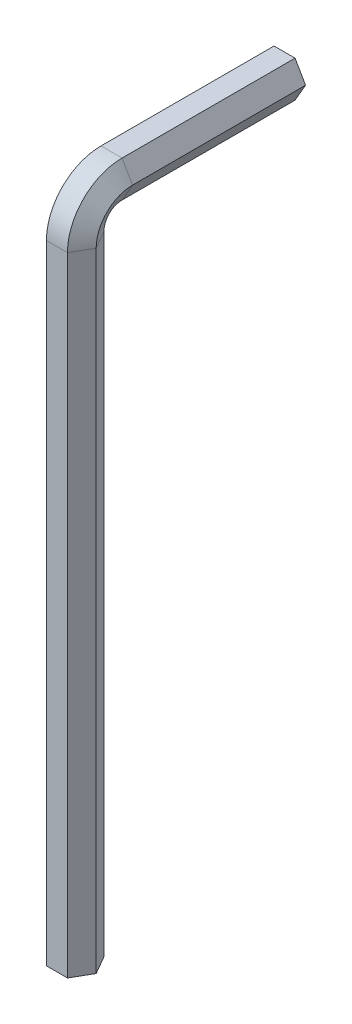
ISO-10303-21;
HEADER;
FILE_DESCRIPTION(('STEP AP214'),'2;1');
FILE_NAME('part.step','',(''),(''),'','','');
FILE_SCHEMA(('AUTOMOTIVE_DESIGN { 1 0 10303 214 1 1 1 1 }'));
ENDSEC;
DATA;
#1=APPLICATION_CONTEXT('core data for automotive mechanical design processes');
#2=APPLICATION_PROTOCOL_DEFINITION('international standard','automotive_design',2000,#1);
#3=PRODUCT_CONTEXT('',#1,'mechanical');
#4=PRODUCT('Part','Part','',(#3));
#5=PRODUCT_RELATED_PRODUCT_CATEGORY('part','',(#4));
#6=PRODUCT_DEFINITION_FORMATION('','',#4);
#7=PRODUCT_DEFINITION_CONTEXT('part definition',#1,'design');
#8=PRODUCT_DEFINITION('design','',#6,#7);
#9=PRODUCT_DEFINITION_SHAPE('','',#8);
#10=(LENGTH_UNIT() NAMED_UNIT(*) SI_UNIT(.MILLI.,.METRE.));
#11=(NAMED_UNIT(*) PLANE_ANGLE_UNIT() SI_UNIT($,.RADIAN.));
#12=(NAMED_UNIT(*) SI_UNIT($,.STERADIAN.) SOLID_ANGLE_UNIT());
#13=UNCERTAINTY_MEASURE_WITH_UNIT(LENGTH_MEASURE(1.E-05),#10,'distance_accuracy_value','');
#14=(GEOMETRIC_REPRESENTATION_CONTEXT(3) GLOBAL_UNCERTAINTY_ASSIGNED_CONTEXT((#13)) GLOBAL_UNIT_ASSIGNED_CONTEXT((#10,
#11,#12)) REPRESENTATION_CONTEXT('',''));
#15=CARTESIAN_POINT('',(0.,0.,0.));
#16=DIRECTION('',(0.,0.,1.));
#17=DIRECTION('',(1.,0.,0.));
#18=AXIS2_PLACEMENT_3D('',#15,#16,#17);
#19=CARTESIAN_POINT('',(0.,0.,-75.));
#20=DIRECTION('',(0.,-1.,0.));
#21=DIRECTION('',(1.,0.,0.));
#22=AXIS2_PLACEMENT_3D('',#19,#20,#21);
#23=PLANE('',#22);
#24=DIRECTION('',(-1.,0.,0.));
#25=VECTOR('',#24,1.);
#26=CARTESIAN_POINT('',(1.15470053837931,0.,0.));
#27=LINE('',#26,#25);
#28=CARTESIAN_POINT('',(1.15470053837931,0.,0.));
#29=VERTEX_POINT('',#28);
#30=CARTESIAN_POINT('',(-1.15470053837919,0.,0.));
#31=VERTEX_POINT('',#30);
#32=EDGE_CURVE('E206',#29,#31,#27,.T.);
#33=ORIENTED_EDGE('',*,*,#32,.T.);
#34=DIRECTION('',(-0.500000000000001,0.,-0.866025403784438));
#35=VECTOR('',#34,1.);
#36=CARTESIAN_POINT('',(-1.15470053837919,0.,0.));
#37=LINE('',#36,#35);
#38=CARTESIAN_POINT('',(-2.30940107675844,0.,-1.99999999999999));
#39=VERTEX_POINT('',#38);
#40=EDGE_CURVE('E159',#31,#39,#37,.T.);
#41=ORIENTED_EDGE('',*,*,#40,.T.);
#42=DIRECTION('',(0.5,0.,-0.866025403784438));
#43=VECTOR('',#42,1.);
#44=CARTESIAN_POINT('',(-2.30940107675844,0.,-1.99999999999999));
#45=LINE('',#44,#43);
#46=CARTESIAN_POINT('',(-1.15470053837918,0.,-3.99999999999999));
#47=VERTEX_POINT('',#46);
#48=EDGE_CURVE('E155',#39,#47,#45,.T.);
#49=ORIENTED_EDGE('',*,*,#48,.T.);
#50=DIRECTION('',(1.,0.,0.));
#51=VECTOR('',#50,1.);
#52=CARTESIAN_POINT('',(-1.15470053837918,0.,-3.99999999999999));
#53=LINE('',#52,#51);
#54=CARTESIAN_POINT('',(1.15470053837931,0.,-3.99999999999999));
#55=VERTEX_POINT('',#54);
#56=EDGE_CURVE('E144',#47,#55,#53,.T.);
#57=ORIENTED_EDGE('',*,*,#56,.T.);
#58=DIRECTION('',(0.500000000000002,0.,0.866025403784437));
#59=VECTOR('',#58,1.);
#60=CARTESIAN_POINT('',(1.15470053837931,0.,-3.99999999999999));
#61=LINE('',#60,#59);
#62=CARTESIAN_POINT('',(2.30940107675856,0.,-2.));
#63=VERTEX_POINT('',#62);
#64=EDGE_CURVE('E241',#55,#63,#61,.T.);
#65=ORIENTED_EDGE('',*,*,#64,.T.);
#66=DIRECTION('',(-0.499999999999998,0.,0.866025403784439));
#67=VECTOR('',#66,1.);
#68=CARTESIAN_POINT('',(2.30940107675856,0.,-2.));
#69=LINE('',#68,#67);
#70=EDGE_CURVE('E264',#63,#29,#69,.T.);
#71=ORIENTED_EDGE('',*,*,#70,.T.);
#72=EDGE_LOOP('',(#33,#41,#49,#57,#65,#71));
#73=FACE_BOUND('',#72,.T.);
#74=ADVANCED_FACE('F44',(#73),#23,.T.);
#75=CARTESIAN_POINT('',(0.,0.,-25.));
#76=DIRECTION('',(0.,0.,1.));
#77=DIRECTION('',(1.,0.,0.));
#78=AXIS2_PLACEMENT_3D('',#75,#76,#77);
#79=PLANE('',#78);
#80=DIRECTION('',(-1.,0.,0.));
#81=VECTOR('',#80,1.);
#82=CARTESIAN_POINT('',(1.15470053837931,75.,-25.));
#83=LINE('',#82,#81);
#84=CARTESIAN_POINT('',(1.15470053837931,75.,-25.));
#85=VERTEX_POINT('',#84);
#86=CARTESIAN_POINT('',(-1.15470053837919,75.,-25.));
#87=VERTEX_POINT('',#86);
#88=EDGE_CURVE('E171',#85,#87,#83,.T.);
#89=ORIENTED_EDGE('',*,*,#88,.F.);
#90=DIRECTION('',(-0.499999999999998,0.866025403784439,0.));
#91=VECTOR('',#90,1.);
#92=CARTESIAN_POINT('',(2.30940107675856,73.,-25.));
#93=LINE('',#92,#91);
#94=CARTESIAN_POINT('',(2.30940107675856,73.,-25.));
#95=VERTEX_POINT('',#94);
#96=EDGE_CURVE('E11',#95,#85,#93,.T.);
#97=ORIENTED_EDGE('',*,*,#96,.F.);
#98=DIRECTION('',(0.500000000000002,0.866025403784437,0.));
#99=VECTOR('',#98,1.);
#100=CARTESIAN_POINT('',(1.15470053837931,71.,-25.));
#101=LINE('',#100,#99);
#102=CARTESIAN_POINT('',(1.15470053837931,71.,-25.));
#103=VERTEX_POINT('',#102);
#104=EDGE_CURVE('E58',#103,#95,#101,.T.);
#105=ORIENTED_EDGE('',*,*,#104,.F.);
#106=DIRECTION('',(1.,0.,0.));
#107=VECTOR('',#106,1.);
#108=CARTESIAN_POINT('',(-1.15470053837918,71.,-25.));
#109=LINE('',#108,#107);
#110=CARTESIAN_POINT('',(-1.15470053837918,71.,-25.));
#111=VERTEX_POINT('',#110);
#112=EDGE_CURVE('E67',#111,#103,#109,.T.);
#113=ORIENTED_EDGE('',*,*,#112,.F.);
#114=DIRECTION('',(0.5,-0.866025403784438,0.));
#115=VECTOR('',#114,1.);
#116=CARTESIAN_POINT('',(-2.30940107675844,73.,-25.));
#117=LINE('',#116,#115);
#118=CARTESIAN_POINT('',(-2.30940107675844,73.,-25.));
#119=VERTEX_POINT('',#118);
#120=EDGE_CURVE('E189',#119,#111,#117,.T.);
#121=ORIENTED_EDGE('',*,*,#120,.F.);
#122=DIRECTION('',(-0.500000000000001,-0.866025403784438,0.));
#123=VECTOR('',#122,1.);
#124=CARTESIAN_POINT('',(-1.15470053837919,75.,-25.));
#125=LINE('',#124,#123);
#126=EDGE_CURVE('E187',#87,#119,#125,.T.);
#127=ORIENTED_EDGE('',*,*,#126,.F.);
#128=EDGE_LOOP('',(#89,#97,#105,#113,#121,#127));
#129=FACE_BOUND('',#128,.T.);
#130=ADVANCED_FACE('F190',(#129),#79,.F.);
#131=CARTESIAN_POINT('',(1.15470053837931,0.,0.));
#132=DIRECTION('',(0.,0.,-1.));
#133=DIRECTION('',(0.,1.,0.));
#134=AXIS2_PLACEMENT_3D('',#131,#132,#133);
#135=PLANE('',#134);
#136=DIRECTION('',(0.,1.,0.));
#137=VECTOR('',#136,1.);
#138=CARTESIAN_POINT('',(-1.15470053837919,0.,0.));
#139=LINE('',#138,#137);
#140=CARTESIAN_POINT('',(-1.15470053837919,69.,0.));
#141=VERTEX_POINT('',#140);
#142=EDGE_CURVE('E215',#31,#141,#139,.T.);
#143=ORIENTED_EDGE('',*,*,#142,.F.);
#144=ORIENTED_EDGE('',*,*,#32,.F.);
#145=DIRECTION('',(0.,1.,0.));
#146=VECTOR('',#145,1.);
#147=CARTESIAN_POINT('',(1.15470053837931,0.,0.));
#148=LINE('',#147,#146);
#149=CARTESIAN_POINT('',(1.15470053837931,69.,0.));
#150=VERTEX_POINT('',#149);
#151=EDGE_CURVE('E288',#29,#150,#148,.T.);
#152=ORIENTED_EDGE('',*,*,#151,.T.);
#153=DIRECTION('',(-1.,0.,0.));
#154=VECTOR('',#153,1.);
#155=CARTESIAN_POINT('',(1.15470053837931,69.,0.));
#156=LINE('',#155,#154);
#157=EDGE_CURVE('E307',#150,#141,#156,.T.);
#158=ORIENTED_EDGE('',*,*,#157,.T.);
#159=EDGE_LOOP('',(#143,#144,#152,#158));
#160=FACE_BOUND('',#159,.T.);
#161=ADVANCED_FACE('F322',(#160),#135,.F.);
#162=CARTESIAN_POINT('',(-1.15470053837919,0.,0.));
#163=DIRECTION('',(0.866025403784438,0.,-0.500000000000001));
#164=DIRECTION('',(-0.500000000000001,0.,-0.866025403784438));
#165=AXIS2_PLACEMENT_3D('',#162,#163,#164);
#166=PLANE('',#165);
#167=DIRECTION('',(0.,1.,0.));
#168=VECTOR('',#167,1.);
#169=CARTESIAN_POINT('',(-2.30940107675844,0.,-1.99999999999999));
#170=LINE('',#169,#168);
#171=CARTESIAN_POINT('',(-2.30940107675844,69.,-1.99999999999997));
#172=VERTEX_POINT('',#171);
#173=EDGE_CURVE('E211',#39,#172,#170,.T.);
#174=ORIENTED_EDGE('',*,*,#173,.F.);
#175=ORIENTED_EDGE('',*,*,#40,.F.);
#176=ORIENTED_EDGE('',*,*,#142,.T.);
#177=DIRECTION('',(-0.500000000000001,0.,-0.866025403784438));
#178=VECTOR('',#177,1.);
#179=CARTESIAN_POINT('',(-1.15470053837919,69.,0.));
#180=LINE('',#179,#178);
#181=EDGE_CURVE('E210',#141,#172,#180,.T.);
#182=ORIENTED_EDGE('',*,*,#181,.T.);
#183=EDGE_LOOP('',(#174,#175,#176,#182));
#184=FACE_BOUND('',#183,.T.);
#185=ADVANCED_FACE('F324',(#184),#166,.F.);
#186=CARTESIAN_POINT('',(-2.30940107675844,0.,-1.99999999999999));
#187=DIRECTION('',(0.866025403784438,0.,0.5));
#188=DIRECTION('',(0.5,0.,-0.866025403784438));
#189=AXIS2_PLACEMENT_3D('',#186,#187,#188);
#190=PLANE('',#189);
#191=DIRECTION('',(0.,1.,0.));
#192=VECTOR('',#191,1.);
#193=CARTESIAN_POINT('',(-1.15470053837918,0.,-3.99999999999999));
#194=LINE('',#193,#192);
#195=CARTESIAN_POINT('',(-1.15470053837918,69.,-3.99999999999997));
#196=VERTEX_POINT('',#195);
#197=EDGE_CURVE('E226',#47,#196,#194,.T.);
#198=ORIENTED_EDGE('',*,*,#197,.F.);
#199=ORIENTED_EDGE('',*,*,#48,.F.);
#200=ORIENTED_EDGE('',*,*,#173,.T.);
#201=DIRECTION('',(0.5,0.,-0.866025403784438));
#202=VECTOR('',#201,1.);
#203=CARTESIAN_POINT('',(-2.30940107675844,69.,-1.99999999999997));
#204=LINE('',#203,#202);
#205=EDGE_CURVE('E214',#172,#196,#204,.T.);
#206=ORIENTED_EDGE('',*,*,#205,.T.);
#207=EDGE_LOOP('',(#198,#199,#200,#206));
#208=FACE_BOUND('',#207,.T.);
#209=ADVANCED_FACE('F377',(#208),#190,.F.);
#210=CARTESIAN_POINT('',(-1.15470053837918,0.,-3.99999999999999));
#211=DIRECTION('',(0.,0.,1.));
#212=DIRECTION('',(0.,-1.,0.));
#213=AXIS2_PLACEMENT_3D('',#210,#211,#212);
#214=PLANE('',#213);
#215=DIRECTION('',(0.,1.,0.));
#216=VECTOR('',#215,1.);
#217=CARTESIAN_POINT('',(1.15470053837931,0.,-3.99999999999999));
#218=LINE('',#217,#216);
#219=CARTESIAN_POINT('',(1.15470053837931,69.,-3.99999999999997));
#220=VERTEX_POINT('',#219);
#221=EDGE_CURVE('E248',#55,#220,#218,.T.);
#222=ORIENTED_EDGE('',*,*,#221,.F.);
#223=ORIENTED_EDGE('',*,*,#56,.F.);
#224=ORIENTED_EDGE('',*,*,#197,.T.);
#225=DIRECTION('',(1.,0.,0.));
#226=VECTOR('',#225,1.);
#227=CARTESIAN_POINT('',(-1.15470053837918,69.,-3.99999999999998));
#228=LINE('',#227,#226);
#229=EDGE_CURVE('E235',#196,#220,#228,.T.);
#230=ORIENTED_EDGE('',*,*,#229,.T.);
#231=EDGE_LOOP('',(#222,#223,#224,#230));
#232=FACE_BOUND('',#231,.T.);
#233=ADVANCED_FACE('F390',(#232),#214,.F.);
#234=CARTESIAN_POINT('',(1.15470053837931,0.,-3.99999999999999));
#235=DIRECTION('',(-0.866025403784437,0.,0.500000000000002));
#236=DIRECTION('',(0.500000000000002,0.,0.866025403784437));
#237=AXIS2_PLACEMENT_3D('',#234,#235,#236);
#238=PLANE('',#237);
#239=DIRECTION('',(0.,1.,0.));
#240=VECTOR('',#239,1.);
#241=CARTESIAN_POINT('',(2.30940107675856,0.,-2.));
#242=LINE('',#241,#240);
#243=CARTESIAN_POINT('',(2.30940107675856,69.,-1.99999999999999));
#244=VERTEX_POINT('',#243);
#245=EDGE_CURVE('E267',#63,#244,#242,.T.);
#246=ORIENTED_EDGE('',*,*,#245,.F.);
#247=ORIENTED_EDGE('',*,*,#64,.F.);
#248=ORIENTED_EDGE('',*,*,#221,.T.);
#249=DIRECTION('',(0.500000000000002,0.,0.866025403784437));
#250=VECTOR('',#249,1.);
#251=CARTESIAN_POINT('',(1.15470053837931,69.,-3.99999999999998));
#252=LINE('',#251,#250);
#253=EDGE_CURVE('E252',#220,#244,#252,.T.);
#254=ORIENTED_EDGE('',*,*,#253,.T.);
#255=EDGE_LOOP('',(#246,#247,#248,#254));
#256=FACE_BOUND('',#255,.T.);
#257=ADVANCED_FACE('F396',(#256),#238,.F.);
#258=CARTESIAN_POINT('',(2.30940107675856,0.,-2.));
#259=DIRECTION('',(-0.86602540378444,0.,-0.499999999999998));
#260=DIRECTION('',(-0.499999999999998,0.,0.86602540378444));
#261=AXIS2_PLACEMENT_3D('',#258,#259,#260);
#262=PLANE('',#261);
#263=DIRECTION('',(-0.499999999999998,0.,0.866025403784439));
#264=VECTOR('',#263,1.);
#265=CARTESIAN_POINT('',(2.30940107675856,69.,-1.99999999999999));
#266=LINE('',#265,#264);
#267=EDGE_CURVE('E272',#244,#150,#266,.T.);
#268=ORIENTED_EDGE('',*,*,#267,.T.);
#269=ORIENTED_EDGE('',*,*,#151,.F.);
#270=ORIENTED_EDGE('',*,*,#70,.F.);
#271=ORIENTED_EDGE('',*,*,#245,.T.);
#272=EDGE_LOOP('',(#268,#269,#270,#271));
#273=FACE_BOUND('',#272,.T.);
#274=ADVANCED_FACE('F337',(#273),#262,.F.);
#275=CARTESIAN_POINT('',(0.,69.,-5.99999999999998));
#276=DIRECTION('',(-1.,0.,0.));
#277=DIRECTION('',(0.,0.,1.));
#278=AXIS2_PLACEMENT_3D('',#275,#276,#277);
#279=CYLINDRICAL_SURFACE('',#278,6.);
#280=CARTESIAN_POINT('',(-1.15470053837919,69.,-5.99999999999998));
#281=DIRECTION('',(-1.,0.,0.));
#282=DIRECTION('',(0.,0.,1.));
#283=AXIS2_PLACEMENT_3D('',#280,#281,#282);
#284=CIRCLE('',#283,6.);
#285=CARTESIAN_POINT('',(-1.15470053837919,75.,-5.99999999999997));
#286=VERTEX_POINT('',#285);
#287=EDGE_CURVE('E217',#141,#286,#284,.T.);
#288=ORIENTED_EDGE('',*,*,#287,.F.);
#289=ORIENTED_EDGE('',*,*,#157,.F.);
#290=CARTESIAN_POINT('',(1.15470053837931,69.,-5.99999999999998));
#291=DIRECTION('',(-1.,0.,0.));
#292=DIRECTION('',(0.,0.,1.));
#293=AXIS2_PLACEMENT_3D('',#290,#291,#292);
#294=CIRCLE('',#293,6.);
#295=CARTESIAN_POINT('',(1.15470053837931,75.,-5.99999999999997));
#296=VERTEX_POINT('',#295);
#297=EDGE_CURVE('E292',#150,#296,#294,.T.);
#298=ORIENTED_EDGE('',*,*,#297,.T.);
#299=DIRECTION('',(-1.,0.,0.));
#300=VECTOR('',#299,1.);
#301=CARTESIAN_POINT('',(1.15470053837931,75.,-5.99999999999997));
#302=LINE('',#301,#300);
#303=EDGE_CURVE('E298',#296,#286,#302,.T.);
#304=ORIENTED_EDGE('',*,*,#303,.T.);
#305=EDGE_LOOP('',(#288,#289,#298,#304));
#306=FACE_BOUND('',#305,.T.);
#307=ADVANCED_FACE('F304',(#306),#279,.T.);
#308=CARTESIAN_POINT('',(-1.15470053837919,69.,-5.99999999999998));
#309=DIRECTION('',(1.,0.,0.));
#310=DIRECTION('',(0.,0.,-1.));
#311=AXIS2_PLACEMENT_3D('',#308,#309,#310);
#312=CONICAL_SURFACE('',#311,6.,1.0471975511966);
#313=CARTESIAN_POINT('',(-2.30940107675844,69.,-5.99999999999998));
#314=DIRECTION('',(-1.,0.,0.));
#315=DIRECTION('',(0.,0.,1.));
#316=AXIS2_PLACEMENT_3D('',#313,#314,#315);
#317=CIRCLE('',#316,4.00000000000001);
#318=CARTESIAN_POINT('',(-2.30940107675844,73.,-5.99999999999997));
#319=VERTEX_POINT('',#318);
#320=EDGE_CURVE('E135',#172,#319,#317,.T.);
#321=ORIENTED_EDGE('',*,*,#320,.F.);
#322=ORIENTED_EDGE('',*,*,#181,.F.);
#323=ORIENTED_EDGE('',*,*,#287,.T.);
#324=DIRECTION('',(-0.500000000000001,-0.866025403784438,0.));
#325=VECTOR('',#324,1.);
#326=CARTESIAN_POINT('',(-1.15470053837919,75.,-5.99999999999997));
#327=LINE('',#326,#325);
#328=EDGE_CURVE('E194',#286,#319,#327,.T.);
#329=ORIENTED_EDGE('',*,*,#328,.T.);
#330=EDGE_LOOP('',(#321,#322,#323,#329));
#331=FACE_BOUND('',#330,.T.);
#332=ADVANCED_FACE('F326',(#331),#312,.T.);
#333=CARTESIAN_POINT('',(-2.30940107675844,69.,-5.99999999999998));
#334=DIRECTION('',(-1.,0.,0.));
#335=DIRECTION('',(0.,0.,1.));
#336=AXIS2_PLACEMENT_3D('',#333,#334,#335);
#337=CONICAL_SURFACE('',#336,4.00000000000001,1.0471975511966);
#338=CARTESIAN_POINT('',(-1.15470053837918,69.,-5.99999999999998));
#339=DIRECTION('',(-1.,0.,0.));
#340=DIRECTION('',(0.,0.,1.));
#341=AXIS2_PLACEMENT_3D('',#338,#339,#340);
#342=CIRCLE('',#341,2.00000000000001);
#343=CARTESIAN_POINT('',(-1.15470053837918,71.,-5.99999999999997));
#344=VERTEX_POINT('',#343);
#345=EDGE_CURVE('E122',#196,#344,#342,.T.);
#346=ORIENTED_EDGE('',*,*,#345,.F.);
#347=ORIENTED_EDGE('',*,*,#205,.F.);
#348=ORIENTED_EDGE('',*,*,#320,.T.);
#349=DIRECTION('',(0.5,-0.866025403784438,0.));
#350=VECTOR('',#349,1.);
#351=CARTESIAN_POINT('',(-2.30940107675844,73.,-5.99999999999997));
#352=LINE('',#351,#350);
#353=EDGE_CURVE('E219',#319,#344,#352,.T.);
#354=ORIENTED_EDGE('',*,*,#353,.T.);
#355=EDGE_LOOP('',(#346,#347,#348,#354));
#356=FACE_BOUND('',#355,.T.);
#357=ADVANCED_FACE('F327',(#356),#337,.F.);
#358=CARTESIAN_POINT('',(0.,69.,-5.99999999999998));
#359=DIRECTION('',(-1.,0.,0.));
#360=DIRECTION('',(0.,0.,1.));
#361=AXIS2_PLACEMENT_3D('',#358,#359,#360);
#362=CYLINDRICAL_SURFACE('',#361,2.00000000000001);
#363=CARTESIAN_POINT('',(1.15470053837931,69.,-5.99999999999998));
#364=DIRECTION('',(-1.,0.,0.));
#365=DIRECTION('',(0.,0.,1.));
#366=AXIS2_PLACEMENT_3D('',#363,#364,#365);
#367=CIRCLE('',#366,2.00000000000001);
#368=CARTESIAN_POINT('',(1.15470053837931,71.,-5.99999999999997));
#369=VERTEX_POINT('',#368);
#370=EDGE_CURVE('E117',#220,#369,#367,.T.);
#371=ORIENTED_EDGE('',*,*,#370,.F.);
#372=ORIENTED_EDGE('',*,*,#229,.F.);
#373=ORIENTED_EDGE('',*,*,#345,.T.);
#374=DIRECTION('',(1.,0.,0.));
#375=VECTOR('',#374,1.);
#376=CARTESIAN_POINT('',(-1.15470053837918,71.,-5.99999999999997));
#377=LINE('',#376,#375);
#378=EDGE_CURVE('E240',#344,#369,#377,.T.);
#379=ORIENTED_EDGE('',*,*,#378,.T.);
#380=EDGE_LOOP('',(#371,#372,#373,#379));
#381=FACE_BOUND('',#380,.T.);
#382=ADVANCED_FACE('F331',(#381),#362,.F.);
#383=CARTESIAN_POINT('',(1.15470053837931,69.,-5.99999999999998));
#384=DIRECTION('',(1.,0.,0.));
#385=DIRECTION('',(0.,0.,-1.));
#386=AXIS2_PLACEMENT_3D('',#383,#384,#385);
#387=CONICAL_SURFACE('',#386,2.00000000000001,1.0471975511966);
#388=CARTESIAN_POINT('',(2.30940107675856,69.,-5.99999999999998));
#389=DIRECTION('',(-1.,0.,0.));
#390=DIRECTION('',(0.,0.,1.));
#391=AXIS2_PLACEMENT_3D('',#388,#389,#390);
#392=CIRCLE('',#391,4.);
#393=CARTESIAN_POINT('',(2.30940107675856,73.,-5.99999999999997));
#394=VERTEX_POINT('',#393);
#395=EDGE_CURVE('E280',#244,#394,#392,.T.);
#396=ORIENTED_EDGE('',*,*,#395,.F.);
#397=ORIENTED_EDGE('',*,*,#253,.F.);
#398=ORIENTED_EDGE('',*,*,#370,.T.);
#399=DIRECTION('',(0.500000000000002,0.866025403784437,0.));
#400=VECTOR('',#399,1.);
#401=CARTESIAN_POINT('',(1.15470053837931,71.,-5.99999999999997));
#402=LINE('',#401,#400);
#403=EDGE_CURVE('E260',#369,#394,#402,.T.);
#404=ORIENTED_EDGE('',*,*,#403,.T.);
#405=EDGE_LOOP('',(#396,#397,#398,#404));
#406=FACE_BOUND('',#405,.T.);
#407=ADVANCED_FACE('F437',(#406),#387,.F.);
#408=CARTESIAN_POINT('',(2.30940107675856,69.,-5.99999999999998));
#409=DIRECTION('',(-1.,0.,0.));
#410=DIRECTION('',(0.,0.,1.));
#411=AXIS2_PLACEMENT_3D('',#408,#409,#410);
#412=CONICAL_SURFACE('',#411,4.,1.0471975511966);
#413=DIRECTION('',(-0.499999999999998,0.866025403784439,0.));
#414=VECTOR('',#413,1.);
#415=CARTESIAN_POINT('',(2.30940107675856,73.,-5.99999999999997));
#416=LINE('',#415,#414);
#417=EDGE_CURVE('E201',#394,#296,#416,.T.);
#418=ORIENTED_EDGE('',*,*,#417,.T.);
#419=ORIENTED_EDGE('',*,*,#297,.F.);
#420=ORIENTED_EDGE('',*,*,#267,.F.);
#421=ORIENTED_EDGE('',*,*,#395,.T.);
#422=EDGE_LOOP('',(#418,#419,#420,#421));
#423=FACE_BOUND('',#422,.T.);
#424=ADVANCED_FACE('F293',(#423),#412,.T.);
#425=CARTESIAN_POINT('',(1.15470053837931,75.,-5.99999999999998));
#426=DIRECTION('',(0.,-1.,0.));
#427=DIRECTION('',(0.,0.,-1.));
#428=AXIS2_PLACEMENT_3D('',#425,#426,#427);
#429=PLANE('',#428);
#430=DIRECTION('',(0.,0.,-1.));
#431=VECTOR('',#430,1.);
#432=CARTESIAN_POINT('',(-1.15470053837919,75.,-5.99999999999998));
#433=LINE('',#432,#431);
#434=EDGE_CURVE('E177',#286,#87,#433,.T.);
#435=ORIENTED_EDGE('',*,*,#434,.F.);
#436=ORIENTED_EDGE('',*,*,#303,.F.);
#437=DIRECTION('',(0.,0.,-1.));
#438=VECTOR('',#437,1.);
#439=CARTESIAN_POINT('',(1.15470053837931,75.,-5.99999999999998));
#440=LINE('',#439,#438);
#441=EDGE_CURVE('E182',#296,#85,#440,.T.);
#442=ORIENTED_EDGE('',*,*,#441,.T.);
#443=ORIENTED_EDGE('',*,*,#88,.T.);
#444=EDGE_LOOP('',(#435,#436,#442,#443));
#445=FACE_BOUND('',#444,.T.);
#446=ADVANCED_FACE('F176',(#445),#429,.F.);
#447=CARTESIAN_POINT('',(-1.15470053837919,75.,-5.99999999999998));
#448=DIRECTION('',(0.866025403784438,-0.500000000000001,0.));
#449=DIRECTION('',(0.500000000000001,0.866025403784438,0.));
#450=AXIS2_PLACEMENT_3D('',#447,#448,#449);
#451=PLANE('',#450);
#452=DIRECTION('',(0.,0.,-1.));
#453=VECTOR('',#452,1.);
#454=CARTESIAN_POINT('',(-2.30940107675844,73.,-5.99999999999998));
#455=LINE('',#454,#453);
#456=EDGE_CURVE('E195',#319,#119,#455,.T.);
#457=ORIENTED_EDGE('',*,*,#456,.F.);
#458=ORIENTED_EDGE('',*,*,#328,.F.);
#459=ORIENTED_EDGE('',*,*,#434,.T.);
#460=ORIENTED_EDGE('',*,*,#126,.T.);
#461=EDGE_LOOP('',(#457,#458,#459,#460));
#462=FACE_BOUND('',#461,.T.);
#463=ADVANCED_FACE('F192',(#462),#451,.F.);
#464=CARTESIAN_POINT('',(-2.30940107675844,73.,-5.99999999999998));
#465=DIRECTION('',(0.866025403784438,0.5,0.));
#466=DIRECTION('',(-0.5,0.866025403784439,0.));
#467=AXIS2_PLACEMENT_3D('',#464,#465,#466);
#468=PLANE('',#467);
#469=DIRECTION('',(0.,0.,-1.));
#470=VECTOR('',#469,1.);
#471=CARTESIAN_POINT('',(-1.15470053837918,71.,-5.99999999999998));
#472=LINE('',#471,#470);
#473=EDGE_CURVE('E101',#344,#111,#472,.T.);
#474=ORIENTED_EDGE('',*,*,#473,.F.);
#475=ORIENTED_EDGE('',*,*,#353,.F.);
#476=ORIENTED_EDGE('',*,*,#456,.T.);
#477=ORIENTED_EDGE('',*,*,#120,.T.);
#478=EDGE_LOOP('',(#474,#475,#476,#477));
#479=FACE_BOUND('',#478,.T.);
#480=ADVANCED_FACE('F473',(#479),#468,.F.);
#481=CARTESIAN_POINT('',(-1.15470053837918,71.,-5.99999999999998));
#482=DIRECTION('',(0.,1.,0.));
#483=DIRECTION('',(0.,0.,1.));
#484=AXIS2_PLACEMENT_3D('',#481,#482,#483);
#485=PLANE('',#484);
#486=DIRECTION('',(0.,0.,-1.));
#487=VECTOR('',#486,1.);
#488=CARTESIAN_POINT('',(1.15470053837931,71.,-5.99999999999998));
#489=LINE('',#488,#487);
#490=EDGE_CURVE('E92',#369,#103,#489,.T.);
#491=ORIENTED_EDGE('',*,*,#490,.F.);
#492=ORIENTED_EDGE('',*,*,#378,.F.);
#493=ORIENTED_EDGE('',*,*,#473,.T.);
#494=ORIENTED_EDGE('',*,*,#112,.T.);
#495=EDGE_LOOP('',(#491,#492,#493,#494));
#496=FACE_BOUND('',#495,.T.);
#497=ADVANCED_FACE('F350',(#496),#485,.F.);
#498=CARTESIAN_POINT('',(1.15470053837931,71.,-5.99999999999998));
#499=DIRECTION('',(-0.866025403784437,0.500000000000002,0.));
#500=DIRECTION('',(-0.500000000000002,-0.866025403784437,0.));
#501=AXIS2_PLACEMENT_3D('',#498,#499,#500);
#502=PLANE('',#501);
#503=DIRECTION('',(0.,0.,-1.));
#504=VECTOR('',#503,1.);
#505=CARTESIAN_POINT('',(2.30940107675856,73.,-5.99999999999998));
#506=LINE('',#505,#504);
#507=EDGE_CURVE('E52',#394,#95,#506,.T.);
#508=ORIENTED_EDGE('',*,*,#507,.F.);
#509=ORIENTED_EDGE('',*,*,#403,.F.);
#510=ORIENTED_EDGE('',*,*,#490,.T.);
#511=ORIENTED_EDGE('',*,*,#104,.T.);
#512=EDGE_LOOP('',(#508,#509,#510,#511));
#513=FACE_BOUND('',#512,.T.);
#514=ADVANCED_FACE('F345',(#513),#502,.F.);
#515=CARTESIAN_POINT('',(2.30940107675856,73.,-5.99999999999998));
#516=DIRECTION('',(-0.866025403784439,-0.499999999999998,0.));
#517=DIRECTION('',(0.499999999999999,-0.86602540378444,0.));
#518=AXIS2_PLACEMENT_3D('',#515,#516,#517);
#519=PLANE('',#518);
#520=ORIENTED_EDGE('',*,*,#96,.T.);
#521=ORIENTED_EDGE('',*,*,#441,.F.);
#522=ORIENTED_EDGE('',*,*,#417,.F.);
#523=ORIENTED_EDGE('',*,*,#507,.T.);
#524=EDGE_LOOP('',(#520,#521,#522,#523));
#525=FACE_BOUND('',#524,.T.);
#526=ADVANCED_FACE('F338',(#525),#519,.F.);
#527=CLOSED_SHELL('',(#74,#130,#161,#185,#209,#233,#257,#274,#307,#332,#357,#382,#407,#424,#446,
#463,#480,#497,#514,#526));
#528=MANIFOLD_SOLID_BREP('B2',#527);
#529=ADVANCED_BREP_SHAPE_REPRESENTATION('',(#18,#528),#14);
#530=SHAPE_DEFINITION_REPRESENTATION(#9,#529);
ENDSEC;
END-ISO-10303-21;
